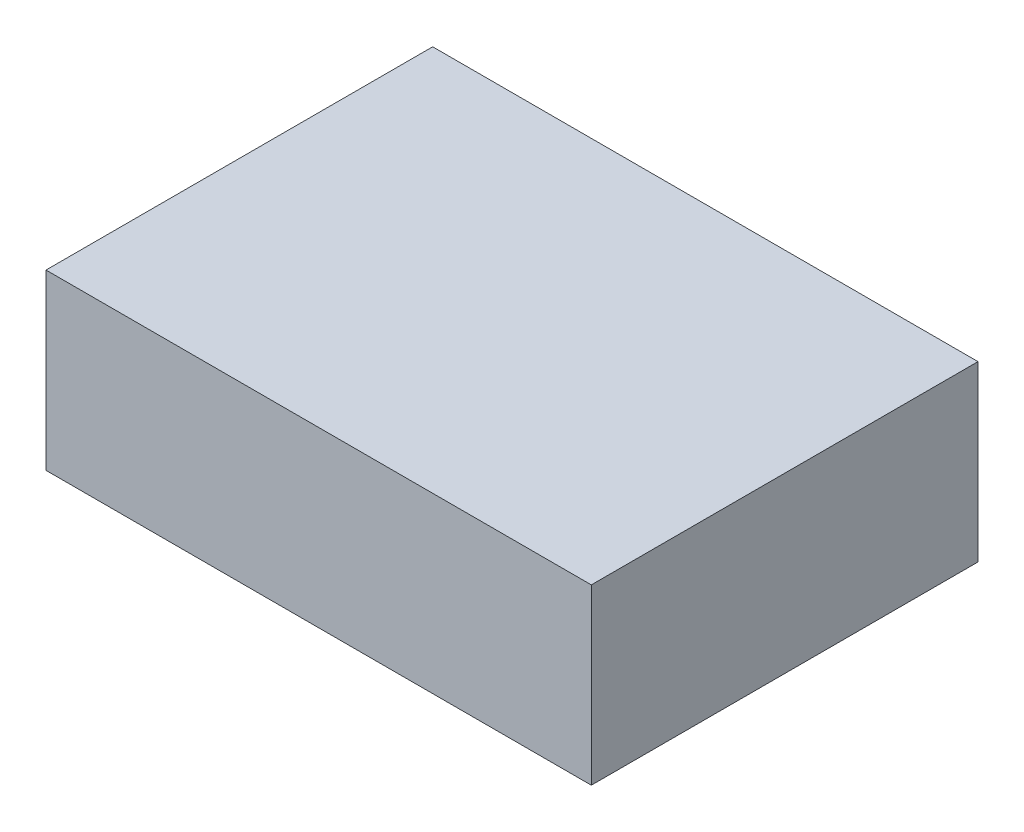
ISO-10303-21;
HEADER;
FILE_DESCRIPTION(('STEP AP214'),'2;1');
FILE_NAME('part.step','',(''),(''),'','','');
FILE_SCHEMA(('AUTOMOTIVE_DESIGN { 1 0 10303 214 1 1 1 1 }'));
ENDSEC;
DATA;
#1=APPLICATION_CONTEXT('core data for automotive mechanical design processes');
#2=APPLICATION_PROTOCOL_DEFINITION('international standard','automotive_design',2000,#1);
#3=PRODUCT_CONTEXT('',#1,'mechanical');
#4=PRODUCT('Part','Part','',(#3));
#5=PRODUCT_RELATED_PRODUCT_CATEGORY('part','',(#4));
#6=PRODUCT_DEFINITION_FORMATION('','',#4);
#7=PRODUCT_DEFINITION_CONTEXT('part definition',#1,'design');
#8=PRODUCT_DEFINITION('design','',#6,#7);
#9=PRODUCT_DEFINITION_SHAPE('','',#8);
#10=(LENGTH_UNIT() NAMED_UNIT(*) SI_UNIT(.MILLI.,.METRE.));
#11=(NAMED_UNIT(*) PLANE_ANGLE_UNIT() SI_UNIT($,.RADIAN.));
#12=(NAMED_UNIT(*) SI_UNIT($,.STERADIAN.) SOLID_ANGLE_UNIT());
#13=UNCERTAINTY_MEASURE_WITH_UNIT(LENGTH_MEASURE(1.E-05),#10,'distance_accuracy_value','');
#14=(GEOMETRIC_REPRESENTATION_CONTEXT(3) GLOBAL_UNCERTAINTY_ASSIGNED_CONTEXT((#13)) GLOBAL_UNIT_ASSIGNED_CONTEXT((#10,
#11,#12)) REPRESENTATION_CONTEXT('',''));
#15=CARTESIAN_POINT('',(0.,0.,0.));
#16=DIRECTION('',(0.,0.,1.));
#17=DIRECTION('',(1.,0.,0.));
#18=AXIS2_PLACEMENT_3D('',#15,#16,#17);
#19=CARTESIAN_POINT('',(-54.999999982,35.,-38.999999978));
#20=DIRECTION('',(1.,0.,0.));
#21=DIRECTION('',(0.,0.,-1.));
#22=AXIS2_PLACEMENT_3D('',#19,#20,#21);
#23=PLANE('',#22);
#24=DIRECTION('',(0.,0.,1.));
#25=VECTOR('',#24,1.);
#26=CARTESIAN_POINT('',(-54.999999982,0.,-38.999999978));
#27=LINE('',#26,#25);
#28=CARTESIAN_POINT('',(-54.999999982,0.,-38.999999978));
#29=VERTEX_POINT('',#28);
#30=CARTESIAN_POINT('',(-54.999999982,0.,38.999999978));
#31=VERTEX_POINT('',#30);
#32=EDGE_CURVE('E107',#29,#31,#27,.T.);
#33=ORIENTED_EDGE('',*,*,#32,.T.);
#34=DIRECTION('',(0.,-1.,0.));
#35=VECTOR('',#34,1.);
#36=CARTESIAN_POINT('',(-54.999999982,35.,38.999999978));
#37=LINE('',#36,#35);
#38=CARTESIAN_POINT('',(-54.999999982,35.,38.999999978));
#39=VERTEX_POINT('',#38);
#40=EDGE_CURVE('E11',#39,#31,#37,.T.);
#41=ORIENTED_EDGE('',*,*,#40,.F.);
#42=DIRECTION('',(0.,0.,1.));
#43=VECTOR('',#42,1.);
#44=CARTESIAN_POINT('',(-54.999999982,35.,-38.999999978));
#45=LINE('',#44,#43);
#46=CARTESIAN_POINT('',(-54.999999982,35.,-38.999999978));
#47=VERTEX_POINT('',#46);
#48=EDGE_CURVE('E89',#47,#39,#45,.T.);
#49=ORIENTED_EDGE('',*,*,#48,.F.);
#50=DIRECTION('',(0.,-1.,0.));
#51=VECTOR('',#50,1.);
#52=CARTESIAN_POINT('',(-54.999999982,35.,-38.999999978));
#53=LINE('',#52,#51);
#54=EDGE_CURVE('E56',#47,#29,#53,.T.);
#55=ORIENTED_EDGE('',*,*,#54,.T.);
#56=EDGE_LOOP('',(#33,#41,#49,#55));
#57=FACE_BOUND('',#56,.T.);
#58=ADVANCED_FACE('F39',(#57),#23,.F.);
#59=CARTESIAN_POINT('',(-54.999999982,35.,38.999999978));
#60=DIRECTION('',(0.,0.,-1.));
#61=DIRECTION('',(-1.,0.,0.));
#62=AXIS2_PLACEMENT_3D('',#59,#60,#61);
#63=PLANE('',#62);
#64=DIRECTION('',(1.,0.,0.));
#65=VECTOR('',#64,1.);
#66=CARTESIAN_POINT('',(-54.999999982,0.,38.999999978));
#67=LINE('',#66,#65);
#68=CARTESIAN_POINT('',(54.999999982,0.,38.999999978));
#69=VERTEX_POINT('',#68);
#70=EDGE_CURVE('E95',#31,#69,#67,.T.);
#71=ORIENTED_EDGE('',*,*,#70,.T.);
#72=DIRECTION('',(0.,-1.,0.));
#73=VECTOR('',#72,1.);
#74=CARTESIAN_POINT('',(54.999999982,35.,38.999999978));
#75=LINE('',#74,#73);
#76=CARTESIAN_POINT('',(54.999999982,35.,38.999999978));
#77=VERTEX_POINT('',#76);
#78=EDGE_CURVE('E48',#77,#69,#75,.T.);
#79=ORIENTED_EDGE('',*,*,#78,.F.);
#80=DIRECTION('',(1.,0.,0.));
#81=VECTOR('',#80,1.);
#82=CARTESIAN_POINT('',(-54.999999982,35.,38.999999978));
#83=LINE('',#82,#81);
#84=EDGE_CURVE('E81',#39,#77,#83,.T.);
#85=ORIENTED_EDGE('',*,*,#84,.F.);
#86=ORIENTED_EDGE('',*,*,#40,.T.);
#87=EDGE_LOOP('',(#71,#79,#85,#86));
#88=FACE_BOUND('',#87,.T.);
#89=ADVANCED_FACE('F94',(#88),#63,.F.);
#90=CARTESIAN_POINT('',(54.999999982,35.,-38.999999978));
#91=DIRECTION('',(1.,0.,0.));
#92=DIRECTION('',(0.,0.,-1.));
#93=AXIS2_PLACEMENT_3D('',#90,#91,#92);
#94=PLANE('',#93);
#95=DIRECTION('',(0.,0.,1.));
#96=VECTOR('',#95,1.);
#97=CARTESIAN_POINT('',(54.999999982,0.,-38.999999978));
#98=LINE('',#97,#96);
#99=CARTESIAN_POINT('',(54.999999982,0.,-38.999999978));
#100=VERTEX_POINT('',#99);
#101=EDGE_CURVE('E112',#100,#69,#98,.T.);
#102=ORIENTED_EDGE('',*,*,#101,.F.);
#103=DIRECTION('',(0.,-1.,0.));
#104=VECTOR('',#103,1.);
#105=CARTESIAN_POINT('',(54.999999982,35.,-38.999999978));
#106=LINE('',#105,#104);
#107=CARTESIAN_POINT('',(54.999999982,35.,-38.999999978));
#108=VERTEX_POINT('',#107);
#109=EDGE_CURVE('E70',#108,#100,#106,.T.);
#110=ORIENTED_EDGE('',*,*,#109,.F.);
#111=DIRECTION('',(0.,0.,1.));
#112=VECTOR('',#111,1.);
#113=CARTESIAN_POINT('',(54.999999982,35.,-38.999999978));
#114=LINE('',#113,#112);
#115=EDGE_CURVE('E88',#108,#77,#114,.T.);
#116=ORIENTED_EDGE('',*,*,#115,.T.);
#117=ORIENTED_EDGE('',*,*,#78,.T.);
#118=EDGE_LOOP('',(#102,#110,#116,#117));
#119=FACE_BOUND('',#118,.T.);
#120=ADVANCED_FACE('F99',(#119),#94,.T.);
#121=CARTESIAN_POINT('',(-54.999999982,35.,-38.999999978));
#122=DIRECTION('',(0.,0.,-1.));
#123=DIRECTION('',(-1.,0.,0.));
#124=AXIS2_PLACEMENT_3D('',#121,#122,#123);
#125=PLANE('',#124);
#126=DIRECTION('',(1.,0.,0.));
#127=VECTOR('',#126,1.);
#128=CARTESIAN_POINT('',(-54.999999982,0.,-38.999999978));
#129=LINE('',#128,#127);
#130=EDGE_CURVE('E115',#29,#100,#129,.T.);
#131=ORIENTED_EDGE('',*,*,#130,.F.);
#132=ORIENTED_EDGE('',*,*,#54,.F.);
#133=DIRECTION('',(1.,0.,0.));
#134=VECTOR('',#133,1.);
#135=CARTESIAN_POINT('',(-54.999999982,35.,-38.999999978));
#136=LINE('',#135,#134);
#137=EDGE_CURVE('E101',#47,#108,#136,.T.);
#138=ORIENTED_EDGE('',*,*,#137,.T.);
#139=ORIENTED_EDGE('',*,*,#109,.T.);
#140=EDGE_LOOP('',(#131,#132,#138,#139));
#141=FACE_BOUND('',#140,.T.);
#142=ADVANCED_FACE('F125',(#141),#125,.T.);
#143=CARTESIAN_POINT('',(0.,35.,0.));
#144=DIRECTION('',(0.,1.,0.));
#145=DIRECTION('',(0.,0.,1.));
#146=AXIS2_PLACEMENT_3D('',#143,#144,#145);
#147=PLANE('',#146);
#148=ORIENTED_EDGE('',*,*,#48,.T.);
#149=ORIENTED_EDGE('',*,*,#84,.T.);
#150=ORIENTED_EDGE('',*,*,#115,.F.);
#151=ORIENTED_EDGE('',*,*,#137,.F.);
#152=EDGE_LOOP('',(#148,#149,#150,#151));
#153=FACE_BOUND('',#152,.T.);
#154=ADVANCED_FACE('F85',(#153),#147,.T.);
#155=CARTESIAN_POINT('',(0.,0.,0.));
#156=DIRECTION('',(0.,1.,0.));
#157=DIRECTION('',(0.,0.,1.));
#158=AXIS2_PLACEMENT_3D('',#155,#156,#157);
#159=PLANE('',#158);
#160=ORIENTED_EDGE('',*,*,#32,.F.);
#161=ORIENTED_EDGE('',*,*,#130,.T.);
#162=ORIENTED_EDGE('',*,*,#101,.T.);
#163=ORIENTED_EDGE('',*,*,#70,.F.);
#164=EDGE_LOOP('',(#160,#161,#162,#163));
#165=FACE_BOUND('',#164,.T.);
#166=ADVANCED_FACE('F124',(#165),#159,.F.);
#167=CLOSED_SHELL('',(#58,#89,#120,#142,#154,#166));
#168=MANIFOLD_SOLID_BREP('B2',#167);
#169=ADVANCED_BREP_SHAPE_REPRESENTATION('',(#18,#168),#14);
#170=SHAPE_DEFINITION_REPRESENTATION(#9,#169);
ENDSEC;
END-ISO-10303-21;
